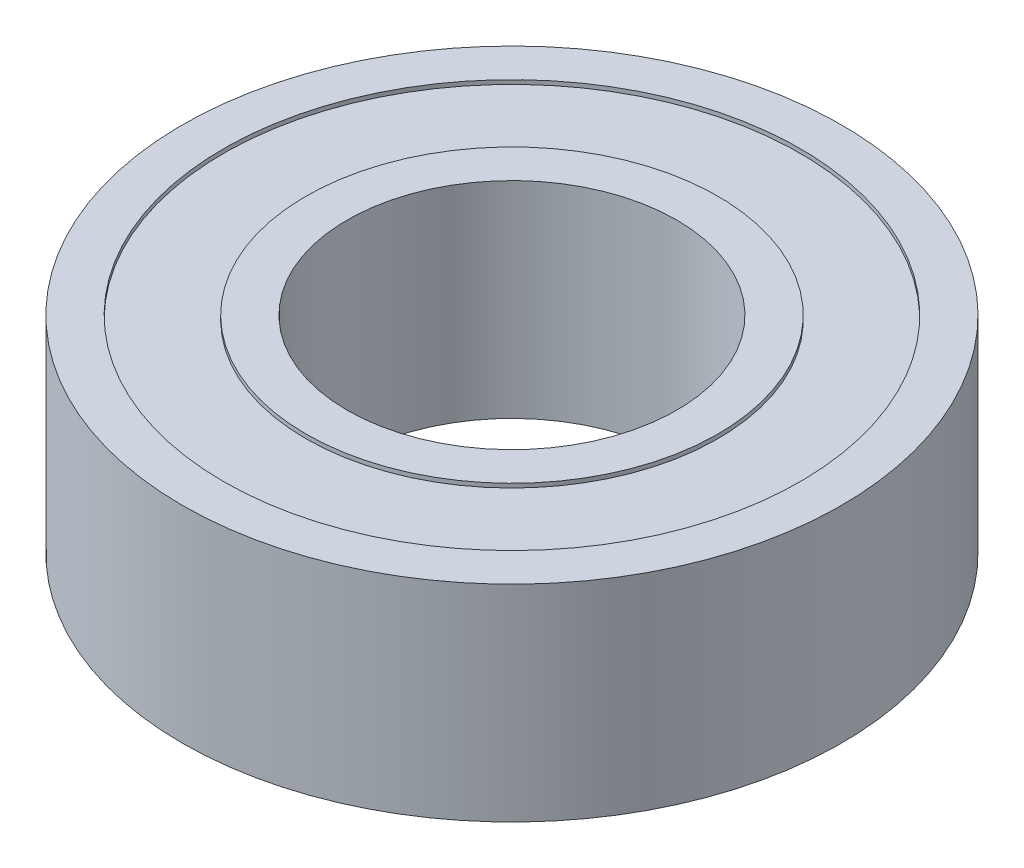
ISO-10303-21;
HEADER;
FILE_DESCRIPTION(('STEP AP214'),'2;1');
FILE_NAME('part.step','',(''),(''),'','','');
FILE_SCHEMA(('AUTOMOTIVE_DESIGN { 1 0 10303 214 1 1 1 1 }'));
ENDSEC;
DATA;
#1=APPLICATION_CONTEXT('core data for automotive mechanical design processes');
#2=APPLICATION_PROTOCOL_DEFINITION('international standard','automotive_design',2000,#1);
#3=PRODUCT_CONTEXT('',#1,'mechanical');
#4=PRODUCT('Part','Part','',(#3));
#5=PRODUCT_RELATED_PRODUCT_CATEGORY('part','',(#4));
#6=PRODUCT_DEFINITION_FORMATION('','',#4);
#7=PRODUCT_DEFINITION_CONTEXT('part definition',#1,'design');
#8=PRODUCT_DEFINITION('design','',#6,#7);
#9=PRODUCT_DEFINITION_SHAPE('','',#8);
#10=(LENGTH_UNIT() NAMED_UNIT(*) SI_UNIT(.MILLI.,.METRE.));
#11=(NAMED_UNIT(*) PLANE_ANGLE_UNIT() SI_UNIT($,.RADIAN.));
#12=(NAMED_UNIT(*) SI_UNIT($,.STERADIAN.) SOLID_ANGLE_UNIT());
#13=UNCERTAINTY_MEASURE_WITH_UNIT(LENGTH_MEASURE(1.E-05),#10,'distance_accuracy_value','');
#14=(GEOMETRIC_REPRESENTATION_CONTEXT(3) GLOBAL_UNCERTAINTY_ASSIGNED_CONTEXT((#13)) GLOBAL_UNIT_ASSIGNED_CONTEXT((#10,
#11,#12)) REPRESENTATION_CONTEXT('',''));
#15=CARTESIAN_POINT('',(0.,0.,0.));
#16=DIRECTION('',(0.,0.,1.));
#17=DIRECTION('',(1.,0.,0.));
#18=AXIS2_PLACEMENT_3D('',#15,#16,#17);
#19=CARTESIAN_POINT('',(0.,0.,0.));
#20=DIRECTION('',(0.,1.,0.));
#21=DIRECTION('',(0.,0.,1.));
#22=AXIS2_PLACEMENT_3D('',#19,#20,#21);
#23=PLANE('',#22);
#24=CARTESIAN_POINT('',(0.,0.,0.));
#25=DIRECTION('',(0.,1.,0.));
#26=DIRECTION('',(0.,0.,1.));
#27=AXIS2_PLACEMENT_3D('',#24,#25,#26);
#28=CIRCLE('',#27,4.);
#29=CARTESIAN_POINT('',(0.,0.,4.));
#30=VERTEX_POINT('',#29);
#31=EDGE_CURVE('E45',#30,#30,#28,.T.);
#32=ORIENTED_EDGE('',*,*,#31,.T.);
#33=EDGE_LOOP('',(#32));
#34=FACE_BOUND('',#33,.T.);
#35=CARTESIAN_POINT('',(0.,0.,0.));
#36=DIRECTION('',(0.,-1.,0.));
#37=DIRECTION('',(0.,0.,-1.));
#38=AXIS2_PLACEMENT_3D('',#35,#36,#37);
#39=CIRCLE('',#38,5.);
#40=CARTESIAN_POINT('',(0.,0.,-5.));
#41=VERTEX_POINT('',#40);
#42=EDGE_CURVE('E69',#41,#41,#39,.T.);
#43=ORIENTED_EDGE('',*,*,#42,.T.);
#44=EDGE_LOOP('',(#43));
#45=FACE_BOUND('',#44,.T.);
#46=ADVANCED_FACE('F32',(#34,#45),#23,.F.);
#47=CARTESIAN_POINT('',(0.,5.,0.));
#48=DIRECTION('',(0.,1.,0.));
#49=DIRECTION('',(0.,0.,1.));
#50=AXIS2_PLACEMENT_3D('',#47,#48,#49);
#51=PLANE('',#50);
#52=CARTESIAN_POINT('',(0.,5.,0.));
#53=DIRECTION('',(0.,1.,0.));
#54=DIRECTION('',(0.,0.,1.));
#55=AXIS2_PLACEMENT_3D('',#52,#53,#54);
#56=CIRCLE('',#55,4.);
#57=CARTESIAN_POINT('',(0.,5.,4.));
#58=VERTEX_POINT('',#57);
#59=EDGE_CURVE('E43',#58,#58,#56,.T.);
#60=ORIENTED_EDGE('',*,*,#59,.F.);
#61=EDGE_LOOP('',(#60));
#62=FACE_BOUND('',#61,.T.);
#63=CARTESIAN_POINT('',(0.,5.,0.));
#64=DIRECTION('',(0.,1.,0.));
#65=DIRECTION('',(0.,0.,1.));
#66=AXIS2_PLACEMENT_3D('',#63,#64,#65);
#67=CIRCLE('',#66,5.);
#68=CARTESIAN_POINT('',(0.,5.,5.));
#69=VERTEX_POINT('',#68);
#70=EDGE_CURVE('E57',#69,#69,#67,.T.);
#71=ORIENTED_EDGE('',*,*,#70,.T.);
#72=EDGE_LOOP('',(#71));
#73=FACE_BOUND('',#72,.T.);
#74=ADVANCED_FACE('F107',(#62,#73),#51,.T.);
#75=CARTESIAN_POINT('',(0.,5.,0.));
#76=DIRECTION('',(0.,1.,0.));
#77=DIRECTION('',(0.,0.,1.));
#78=AXIS2_PLACEMENT_3D('',#75,#76,#77);
#79=CIRCLE('',#78,7.);
#80=CARTESIAN_POINT('',(0.,5.,7.));
#81=VERTEX_POINT('',#80);
#82=EDGE_CURVE('E51',#81,#81,#79,.T.);
#83=ORIENTED_EDGE('',*,*,#82,.F.);
#84=EDGE_LOOP('',(#83));
#85=FACE_BOUND('',#84,.T.);
#86=CARTESIAN_POINT('',(0.,5.,0.));
#87=DIRECTION('',(0.,1.,0.));
#88=DIRECTION('',(0.,0.,1.));
#89=AXIS2_PLACEMENT_3D('',#86,#87,#88);
#90=CIRCLE('',#89,8.);
#91=CARTESIAN_POINT('',(0.,5.,8.));
#92=VERTEX_POINT('',#91);
#93=EDGE_CURVE('E10',#92,#92,#90,.T.);
#94=ORIENTED_EDGE('',*,*,#93,.T.);
#95=EDGE_LOOP('',(#94));
#96=FACE_BOUND('',#95,.T.);
#97=ADVANCED_FACE('F94',(#85,#96),#51,.T.);
#98=CARTESIAN_POINT('',(0.,0.,0.));
#99=DIRECTION('',(0.,-1.,0.));
#100=DIRECTION('',(0.,0.,-1.));
#101=AXIS2_PLACEMENT_3D('',#98,#99,#100);
#102=CIRCLE('',#101,7.);
#103=CARTESIAN_POINT('',(0.,0.,-7.));
#104=VERTEX_POINT('',#103);
#105=EDGE_CURVE('E63',#104,#104,#102,.T.);
#106=ORIENTED_EDGE('',*,*,#105,.F.);
#107=EDGE_LOOP('',(#106));
#108=FACE_BOUND('',#107,.T.);
#109=CARTESIAN_POINT('',(0.,0.,0.));
#110=DIRECTION('',(0.,1.,0.));
#111=DIRECTION('',(0.,0.,1.));
#112=AXIS2_PLACEMENT_3D('',#109,#110,#111);
#113=CIRCLE('',#112,8.);
#114=CARTESIAN_POINT('',(0.,0.,8.));
#115=VERTEX_POINT('',#114);
#116=EDGE_CURVE('E36',#115,#115,#113,.T.);
#117=ORIENTED_EDGE('',*,*,#116,.F.);
#118=EDGE_LOOP('',(#117));
#119=FACE_BOUND('',#118,.T.);
#120=ADVANCED_FACE('F91',(#108,#119),#23,.F.);
#121=CARTESIAN_POINT('',(0.,5.,0.));
#122=DIRECTION('',(0.,-1.,0.));
#123=DIRECTION('',(0.,0.,-1.));
#124=AXIS2_PLACEMENT_3D('',#121,#122,#123);
#125=CYLINDRICAL_SURFACE('',#124,8.);
#126=ORIENTED_EDGE('',*,*,#93,.F.);
#127=EDGE_LOOP('',(#126));
#128=FACE_BOUND('',#127,.T.);
#129=ORIENTED_EDGE('',*,*,#116,.T.);
#130=EDGE_LOOP('',(#129));
#131=FACE_BOUND('',#130,.T.);
#132=ADVANCED_FACE('F34',(#128,#131),#125,.T.);
#133=CARTESIAN_POINT('',(0.,5.,0.));
#134=DIRECTION('',(0.,-1.,0.));
#135=DIRECTION('',(0.,0.,-1.));
#136=AXIS2_PLACEMENT_3D('',#133,#134,#135);
#137=CYLINDRICAL_SURFACE('',#136,4.);
#138=ORIENTED_EDGE('',*,*,#59,.T.);
#139=EDGE_LOOP('',(#138));
#140=FACE_BOUND('',#139,.T.);
#141=ORIENTED_EDGE('',*,*,#31,.F.);
#142=EDGE_LOOP('',(#141));
#143=FACE_BOUND('',#142,.T.);
#144=ADVANCED_FACE('F98',(#140,#143),#137,.F.);
#145=CARTESIAN_POINT('',(0.,4.9,0.));
#146=DIRECTION('',(0.,1.,0.));
#147=DIRECTION('',(0.,0.,1.));
#148=AXIS2_PLACEMENT_3D('',#145,#146,#147);
#149=CYLINDRICAL_SURFACE('',#148,7.);
#150=CARTESIAN_POINT('',(0.,4.9,0.));
#151=DIRECTION('',(0.,1.,0.));
#152=DIRECTION('',(0.,0.,1.));
#153=AXIS2_PLACEMENT_3D('',#150,#151,#152);
#154=CIRCLE('',#153,7.);
#155=CARTESIAN_POINT('',(0.,4.9,7.));
#156=VERTEX_POINT('',#155);
#157=EDGE_CURVE('E48',#156,#156,#154,.T.);
#158=ORIENTED_EDGE('',*,*,#157,.F.);
#159=EDGE_LOOP('',(#158));
#160=FACE_BOUND('',#159,.T.);
#161=ORIENTED_EDGE('',*,*,#82,.T.);
#162=EDGE_LOOP('',(#161));
#163=FACE_BOUND('',#162,.T.);
#164=ADVANCED_FACE('F103',(#160,#163),#149,.F.);
#165=CARTESIAN_POINT('',(0.,4.9,0.));
#166=DIRECTION('',(0.,1.,0.));
#167=DIRECTION('',(0.,0.,1.));
#168=AXIS2_PLACEMENT_3D('',#165,#166,#167);
#169=PLANE('',#168);
#170=CARTESIAN_POINT('',(0.,4.9,0.));
#171=DIRECTION('',(0.,1.,0.));
#172=DIRECTION('',(0.,0.,1.));
#173=AXIS2_PLACEMENT_3D('',#170,#171,#172);
#174=CIRCLE('',#173,5.);
#175=CARTESIAN_POINT('',(0.,4.9,5.));
#176=VERTEX_POINT('',#175);
#177=EDGE_CURVE('E54',#176,#176,#174,.T.);
#178=ORIENTED_EDGE('',*,*,#177,.F.);
#179=EDGE_LOOP('',(#178));
#180=FACE_BOUND('',#179,.T.);
#181=ORIENTED_EDGE('',*,*,#157,.T.);
#182=EDGE_LOOP('',(#181));
#183=FACE_BOUND('',#182,.T.);
#184=ADVANCED_FACE('F120',(#180,#183),#169,.T.);
#185=CARTESIAN_POINT('',(0.,4.9,0.));
#186=DIRECTION('',(0.,1.,0.));
#187=DIRECTION('',(0.,0.,1.));
#188=AXIS2_PLACEMENT_3D('',#185,#186,#187);
#189=CYLINDRICAL_SURFACE('',#188,5.);
#190=ORIENTED_EDGE('',*,*,#177,.T.);
#191=EDGE_LOOP('',(#190));
#192=FACE_BOUND('',#191,.T.);
#193=ORIENTED_EDGE('',*,*,#70,.F.);
#194=EDGE_LOOP('',(#193));
#195=FACE_BOUND('',#194,.T.);
#196=ADVANCED_FACE('F87',(#192,#195),#189,.T.);
#197=CARTESIAN_POINT('',(0.,0.1,0.));
#198=DIRECTION('',(0.,-1.,0.));
#199=DIRECTION('',(0.,0.,-1.));
#200=AXIS2_PLACEMENT_3D('',#197,#198,#199);
#201=CYLINDRICAL_SURFACE('',#200,7.);
#202=CARTESIAN_POINT('',(0.,0.1,0.));
#203=DIRECTION('',(0.,-1.,0.));
#204=DIRECTION('',(0.,0.,-1.));
#205=AXIS2_PLACEMENT_3D('',#202,#203,#204);
#206=CIRCLE('',#205,7.);
#207=CARTESIAN_POINT('',(0.,0.1,-7.));
#208=VERTEX_POINT('',#207);
#209=EDGE_CURVE('E60',#208,#208,#206,.T.);
#210=ORIENTED_EDGE('',*,*,#209,.F.);
#211=EDGE_LOOP('',(#210));
#212=FACE_BOUND('',#211,.T.);
#213=ORIENTED_EDGE('',*,*,#105,.T.);
#214=EDGE_LOOP('',(#213));
#215=FACE_BOUND('',#214,.T.);
#216=ADVANCED_FACE('F81',(#212,#215),#201,.F.);
#217=CARTESIAN_POINT('',(0.,0.1,0.));
#218=DIRECTION('',(0.,-1.,0.));
#219=DIRECTION('',(0.,0.,-1.));
#220=AXIS2_PLACEMENT_3D('',#217,#218,#219);
#221=PLANE('',#220);
#222=CARTESIAN_POINT('',(0.,0.1,0.));
#223=DIRECTION('',(0.,-1.,0.));
#224=DIRECTION('',(0.,0.,-1.));
#225=AXIS2_PLACEMENT_3D('',#222,#223,#224);
#226=CIRCLE('',#225,5.);
#227=CARTESIAN_POINT('',(0.,0.1,-5.));
#228=VERTEX_POINT('',#227);
#229=EDGE_CURVE('E66',#228,#228,#226,.T.);
#230=ORIENTED_EDGE('',*,*,#229,.F.);
#231=EDGE_LOOP('',(#230));
#232=FACE_BOUND('',#231,.T.);
#233=ORIENTED_EDGE('',*,*,#209,.T.);
#234=EDGE_LOOP('',(#233));
#235=FACE_BOUND('',#234,.T.);
#236=ADVANCED_FACE('F78',(#232,#235),#221,.T.);
#237=CARTESIAN_POINT('',(0.,0.1,0.));
#238=DIRECTION('',(0.,-1.,0.));
#239=DIRECTION('',(0.,0.,-1.));
#240=AXIS2_PLACEMENT_3D('',#237,#238,#239);
#241=CYLINDRICAL_SURFACE('',#240,5.);
#242=ORIENTED_EDGE('',*,*,#229,.T.);
#243=EDGE_LOOP('',(#242));
#244=FACE_BOUND('',#243,.T.);
#245=ORIENTED_EDGE('',*,*,#42,.F.);
#246=EDGE_LOOP('',(#245));
#247=FACE_BOUND('',#246,.T.);
#248=ADVANCED_FACE('F75',(#244,#247),#241,.T.);
#249=CLOSED_SHELL('',(#46,#74,#97,#120,#132,#144,#164,#184,#196,#216,#236,#248));
#250=MANIFOLD_SOLID_BREP('B2',#249);
#251=ADVANCED_BREP_SHAPE_REPRESENTATION('',(#18,#250),#14);
#252=SHAPE_DEFINITION_REPRESENTATION(#9,#251);
ENDSEC;
END-ISO-10303-21;
